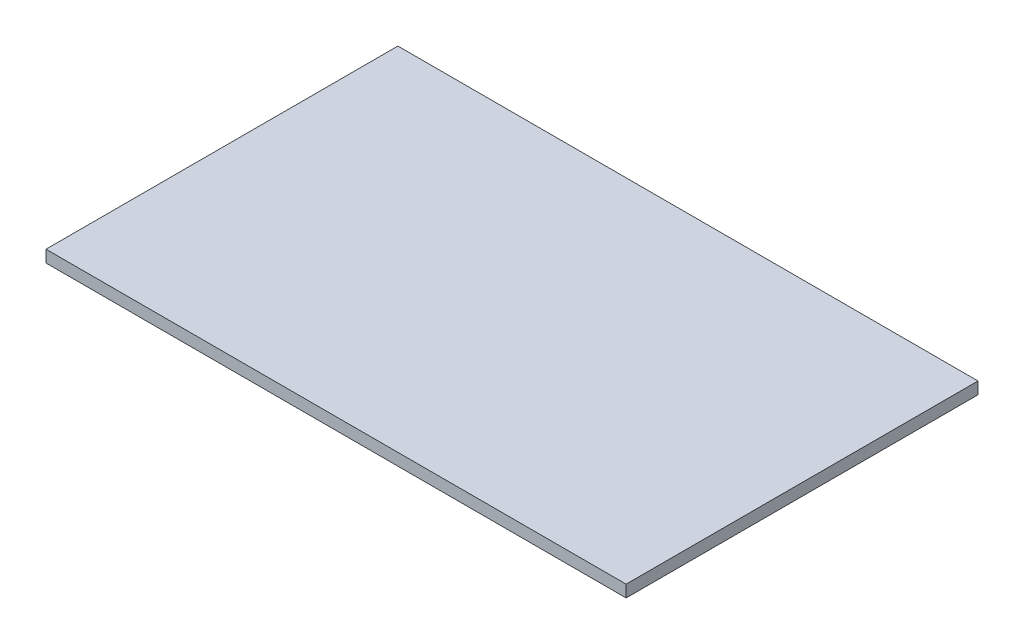
ISO-10303-21;
HEADER;
FILE_DESCRIPTION(('STEP AP214'),'2;1');
FILE_NAME('part.step','',(''),(''),'','','');
FILE_SCHEMA(('AUTOMOTIVE_DESIGN { 1 0 10303 214 1 1 1 1 }'));
ENDSEC;
DATA;
#1=APPLICATION_CONTEXT('core data for automotive mechanical design processes');
#2=APPLICATION_PROTOCOL_DEFINITION('international standard','automotive_design',2000,#1);
#3=PRODUCT_CONTEXT('',#1,'mechanical');
#4=PRODUCT('Part','Part','',(#3));
#5=PRODUCT_RELATED_PRODUCT_CATEGORY('part','',(#4));
#6=PRODUCT_DEFINITION_FORMATION('','',#4);
#7=PRODUCT_DEFINITION_CONTEXT('part definition',#1,'design');
#8=PRODUCT_DEFINITION('design','',#6,#7);
#9=PRODUCT_DEFINITION_SHAPE('','',#8);
#10=(LENGTH_UNIT() NAMED_UNIT(*) SI_UNIT(.MILLI.,.METRE.));
#11=(NAMED_UNIT(*) PLANE_ANGLE_UNIT() SI_UNIT($,.RADIAN.));
#12=(NAMED_UNIT(*) SI_UNIT($,.STERADIAN.) SOLID_ANGLE_UNIT());
#13=UNCERTAINTY_MEASURE_WITH_UNIT(LENGTH_MEASURE(1.E-05),#10,'distance_accuracy_value','');
#14=(GEOMETRIC_REPRESENTATION_CONTEXT(3) GLOBAL_UNCERTAINTY_ASSIGNED_CONTEXT((#13)) GLOBAL_UNIT_ASSIGNED_CONTEXT((#10,
#11,#12)) REPRESENTATION_CONTEXT('',''));
#15=CARTESIAN_POINT('',(0.,0.,0.));
#16=DIRECTION('',(0.,0.,1.));
#17=DIRECTION('',(1.,0.,0.));
#18=AXIS2_PLACEMENT_3D('',#15,#16,#17);
#19=CARTESIAN_POINT('',(0.,1.26,0.));
#20=DIRECTION('',(1.,0.,0.));
#21=DIRECTION('',(0.,0.,-1.));
#22=AXIS2_PLACEMENT_3D('',#19,#20,#21);
#23=PLANE('',#22);
#24=DIRECTION('',(0.,0.,1.));
#25=VECTOR('',#24,1.);
#26=CARTESIAN_POINT('',(0.,0.,0.));
#27=LINE('',#26,#25);
#28=CARTESIAN_POINT('',(0.,0.,-37.));
#29=VERTEX_POINT('',#28);
#30=CARTESIAN_POINT('',(0.,0.,0.));
#31=VERTEX_POINT('',#30);
#32=EDGE_CURVE('E96',#29,#31,#27,.T.);
#33=ORIENTED_EDGE('',*,*,#32,.T.);
#34=DIRECTION('',(0.,-1.,0.));
#35=VECTOR('',#34,1.);
#36=CARTESIAN_POINT('',(0.,1.26,0.));
#37=LINE('',#36,#35);
#38=CARTESIAN_POINT('',(0.,1.26,0.));
#39=VERTEX_POINT('',#38);
#40=EDGE_CURVE('E11',#39,#31,#37,.T.);
#41=ORIENTED_EDGE('',*,*,#40,.F.);
#42=DIRECTION('',(0.,0.,1.));
#43=VECTOR('',#42,1.);
#44=CARTESIAN_POINT('',(0.,1.26,0.));
#45=LINE('',#44,#43);
#46=CARTESIAN_POINT('',(0.,1.26,-37.));
#47=VERTEX_POINT('',#46);
#48=EDGE_CURVE('E84',#47,#39,#45,.T.);
#49=ORIENTED_EDGE('',*,*,#48,.F.);
#50=DIRECTION('',(0.,-1.,0.));
#51=VECTOR('',#50,1.);
#52=CARTESIAN_POINT('',(0.,1.26,-37.));
#53=LINE('',#52,#51);
#54=EDGE_CURVE('E92',#47,#29,#53,.T.);
#55=ORIENTED_EDGE('',*,*,#54,.T.);
#56=EDGE_LOOP('',(#33,#41,#49,#55));
#57=FACE_BOUND('',#56,.T.);
#58=ADVANCED_FACE('F33',(#57),#23,.F.);
#59=CARTESIAN_POINT('',(0.,1.26,0.));
#60=DIRECTION('',(0.,0.,-1.));
#61=DIRECTION('',(-1.,0.,0.));
#62=AXIS2_PLACEMENT_3D('',#59,#60,#61);
#63=PLANE('',#62);
#64=DIRECTION('',(1.,0.,0.));
#65=VECTOR('',#64,1.);
#66=CARTESIAN_POINT('',(0.,0.,0.));
#67=LINE('',#66,#65);
#68=CARTESIAN_POINT('',(61.,0.,0.));
#69=VERTEX_POINT('',#68);
#70=EDGE_CURVE('E88',#31,#69,#67,.T.);
#71=ORIENTED_EDGE('',*,*,#70,.T.);
#72=DIRECTION('',(0.,-1.,0.));
#73=VECTOR('',#72,1.);
#74=CARTESIAN_POINT('',(61.,1.26,0.));
#75=LINE('',#74,#73);
#76=CARTESIAN_POINT('',(61.,1.26,0.));
#77=VERTEX_POINT('',#76);
#78=EDGE_CURVE('E41',#77,#69,#75,.T.);
#79=ORIENTED_EDGE('',*,*,#78,.F.);
#80=DIRECTION('',(1.,0.,0.));
#81=VECTOR('',#80,1.);
#82=CARTESIAN_POINT('',(0.,1.26,0.));
#83=LINE('',#82,#81);
#84=EDGE_CURVE('E79',#39,#77,#83,.T.);
#85=ORIENTED_EDGE('',*,*,#84,.F.);
#86=ORIENTED_EDGE('',*,*,#40,.T.);
#87=EDGE_LOOP('',(#71,#79,#85,#86));
#88=FACE_BOUND('',#87,.T.);
#89=ADVANCED_FACE('F87',(#88),#63,.F.);
#90=CARTESIAN_POINT('',(61.,1.26,0.));
#91=DIRECTION('',(-1.,0.,0.));
#92=DIRECTION('',(0.,0.,1.));
#93=AXIS2_PLACEMENT_3D('',#90,#91,#92);
#94=PLANE('',#93);
#95=DIRECTION('',(0.,0.,-1.));
#96=VECTOR('',#95,1.);
#97=CARTESIAN_POINT('',(61.,0.,0.));
#98=LINE('',#97,#96);
#99=CARTESIAN_POINT('',(61.,0.,-37.));
#100=VERTEX_POINT('',#99);
#101=EDGE_CURVE('E66',#69,#100,#98,.T.);
#102=ORIENTED_EDGE('',*,*,#101,.T.);
#103=DIRECTION('',(0.,-1.,0.));
#104=VECTOR('',#103,1.);
#105=CARTESIAN_POINT('',(61.,1.26,-37.));
#106=LINE('',#105,#104);
#107=CARTESIAN_POINT('',(61.,1.26,-37.));
#108=VERTEX_POINT('',#107);
#109=EDGE_CURVE('E89',#108,#100,#106,.T.);
#110=ORIENTED_EDGE('',*,*,#109,.F.);
#111=DIRECTION('',(0.,0.,-1.));
#112=VECTOR('',#111,1.);
#113=CARTESIAN_POINT('',(61.,1.26,0.));
#114=LINE('',#113,#112);
#115=EDGE_CURVE('E82',#77,#108,#114,.T.);
#116=ORIENTED_EDGE('',*,*,#115,.F.);
#117=ORIENTED_EDGE('',*,*,#78,.T.);
#118=EDGE_LOOP('',(#102,#110,#116,#117));
#119=FACE_BOUND('',#118,.T.);
#120=ADVANCED_FACE('F90',(#119),#94,.F.);
#121=CARTESIAN_POINT('',(0.,1.26,-37.));
#122=DIRECTION('',(0.,0.,1.));
#123=DIRECTION('',(1.,0.,0.));
#124=AXIS2_PLACEMENT_3D('',#121,#122,#123);
#125=PLANE('',#124);
#126=DIRECTION('',(-1.,0.,0.));
#127=VECTOR('',#126,1.);
#128=CARTESIAN_POINT('',(0.,0.,-37.));
#129=LINE('',#128,#127);
#130=EDGE_CURVE('E72',#100,#29,#129,.T.);
#131=ORIENTED_EDGE('',*,*,#130,.T.);
#132=ORIENTED_EDGE('',*,*,#54,.F.);
#133=DIRECTION('',(-1.,0.,0.));
#134=VECTOR('',#133,1.);
#135=CARTESIAN_POINT('',(0.,1.26,-37.));
#136=LINE('',#135,#134);
#137=EDGE_CURVE('E49',#108,#47,#136,.T.);
#138=ORIENTED_EDGE('',*,*,#137,.F.);
#139=ORIENTED_EDGE('',*,*,#109,.T.);
#140=EDGE_LOOP('',(#131,#132,#138,#139));
#141=FACE_BOUND('',#140,.T.);
#142=ADVANCED_FACE('F103',(#141),#125,.F.);
#143=CARTESIAN_POINT('',(0.,1.26,0.));
#144=DIRECTION('',(0.,-1.,0.));
#145=DIRECTION('',(0.,0.,-1.));
#146=AXIS2_PLACEMENT_3D('',#143,#144,#145);
#147=PLANE('',#146);
#148=ORIENTED_EDGE('',*,*,#48,.T.);
#149=ORIENTED_EDGE('',*,*,#84,.T.);
#150=ORIENTED_EDGE('',*,*,#115,.T.);
#151=ORIENTED_EDGE('',*,*,#137,.T.);
#152=EDGE_LOOP('',(#148,#149,#150,#151));
#153=FACE_BOUND('',#152,.T.);
#154=ADVANCED_FACE('F80',(#153),#147,.F.);
#155=CARTESIAN_POINT('',(0.,0.,0.));
#156=DIRECTION('',(0.,-1.,0.));
#157=DIRECTION('',(0.,0.,-1.));
#158=AXIS2_PLACEMENT_3D('',#155,#156,#157);
#159=PLANE('',#158);
#160=ORIENTED_EDGE('',*,*,#32,.F.);
#161=ORIENTED_EDGE('',*,*,#130,.F.);
#162=ORIENTED_EDGE('',*,*,#101,.F.);
#163=ORIENTED_EDGE('',*,*,#70,.F.);
#164=EDGE_LOOP('',(#160,#161,#162,#163));
#165=FACE_BOUND('',#164,.T.);
#166=ADVANCED_FACE('F106',(#165),#159,.T.);
#167=CLOSED_SHELL('',(#58,#89,#120,#142,#154,#166));
#168=MANIFOLD_SOLID_BREP('B2',#167);
#169=ADVANCED_BREP_SHAPE_REPRESENTATION('',(#18,#168),#14);
#170=SHAPE_DEFINITION_REPRESENTATION(#9,#169);
ENDSEC;
END-ISO-10303-21;
